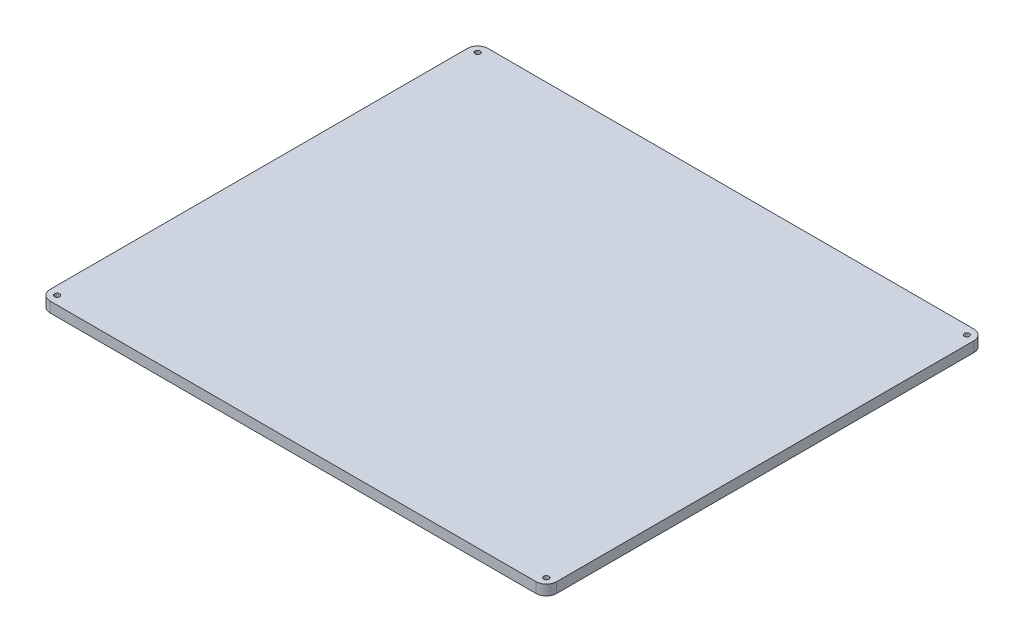
ISO-10303-21;
HEADER;
FILE_DESCRIPTION(('STEP AP214'),'2;1');
FILE_NAME('part.step','',(''),(''),'','','');
FILE_SCHEMA(('AUTOMOTIVE_DESIGN { 1 0 10303 214 1 1 1 1 }'));
ENDSEC;
DATA;
#1=APPLICATION_CONTEXT('core data for automotive mechanical design processes');
#2=APPLICATION_PROTOCOL_DEFINITION('international standard','automotive_design',2000,#1);
#3=PRODUCT_CONTEXT('',#1,'mechanical');
#4=PRODUCT('Part','Part','',(#3));
#5=PRODUCT_RELATED_PRODUCT_CATEGORY('part','',(#4));
#6=PRODUCT_DEFINITION_FORMATION('','',#4);
#7=PRODUCT_DEFINITION_CONTEXT('part definition',#1,'design');
#8=PRODUCT_DEFINITION('design','',#6,#7);
#9=PRODUCT_DEFINITION_SHAPE('','',#8);
#10=(LENGTH_UNIT() NAMED_UNIT(*) SI_UNIT(.MILLI.,.METRE.));
#11=(NAMED_UNIT(*) PLANE_ANGLE_UNIT() SI_UNIT($,.RADIAN.));
#12=(NAMED_UNIT(*) SI_UNIT($,.STERADIAN.) SOLID_ANGLE_UNIT());
#13=UNCERTAINTY_MEASURE_WITH_UNIT(LENGTH_MEASURE(1.E-05),#10,'distance_accuracy_value','');
#14=(GEOMETRIC_REPRESENTATION_CONTEXT(3) GLOBAL_UNCERTAINTY_ASSIGNED_CONTEXT((#13)) GLOBAL_UNIT_ASSIGNED_CONTEXT((#10,
#11,#12)) REPRESENTATION_CONTEXT('',''));
#15=CARTESIAN_POINT('',(0.,0.,0.));
#16=DIRECTION('',(0.,0.,1.));
#17=DIRECTION('',(1.,0.,0.));
#18=AXIS2_PLACEMENT_3D('',#15,#16,#17);
#19=CARTESIAN_POINT('',(161.504362330041,6.,127.25));
#20=DIRECTION('',(0.,-1.,0.));
#21=DIRECTION('',(0.,0.,-1.));
#22=AXIS2_PLACEMENT_3D('',#19,#20,#21);
#23=PLANE('',#22);
#24=CARTESIAN_POINT('',(161.504362330041,6.,127.25));
#25=DIRECTION('',(0.,1.,0.));
#26=DIRECTION('',(0.,0.,-1.));
#27=AXIS2_PLACEMENT_3D('',#24,#25,#26);
#28=CIRCLE('',#27,6.00000000000002);
#29=CARTESIAN_POINT('',(161.504362330041,6.,133.25));
#30=VERTEX_POINT('',#29);
#31=CARTESIAN_POINT('',(167.504362330041,6.,127.25));
#32=VERTEX_POINT('',#31);
#33=EDGE_CURVE('E145',#30,#32,#28,.T.);
#34=ORIENTED_EDGE('',*,*,#33,.T.);
#35=DIRECTION('',(0.,0.,-1.));
#36=VECTOR('',#35,1.);
#37=CARTESIAN_POINT('',(167.504362330041,6.,-115.75));
#38=LINE('',#37,#36);
#39=CARTESIAN_POINT('',(167.504362330041,6.,-115.75));
#40=VERTEX_POINT('',#39);
#41=EDGE_CURVE('E93',#32,#40,#38,.T.);
#42=ORIENTED_EDGE('',*,*,#41,.T.);
#43=CARTESIAN_POINT('',(161.504362330041,6.,-115.75));
#44=DIRECTION('',(0.,1.,0.));
#45=DIRECTION('',(0.,0.,1.));
#46=AXIS2_PLACEMENT_3D('',#43,#44,#45);
#47=CIRCLE('',#46,6.00000000000002);
#48=CARTESIAN_POINT('',(161.504362330041,6.,-121.75));
#49=VERTEX_POINT('',#48);
#50=EDGE_CURVE('E160',#40,#49,#47,.T.);
#51=ORIENTED_EDGE('',*,*,#50,.T.);
#52=DIRECTION('',(-1.,0.,0.));
#53=VECTOR('',#52,1.);
#54=CARTESIAN_POINT('',(-121.495637669959,6.,-121.75));
#55=LINE('',#54,#53);
#56=CARTESIAN_POINT('',(-121.495637669959,6.,-121.75));
#57=VERTEX_POINT('',#56);
#58=EDGE_CURVE('E173',#49,#57,#55,.T.);
#59=ORIENTED_EDGE('',*,*,#58,.T.);
#60=CARTESIAN_POINT('',(-121.495637669959,6.,-115.75));
#61=DIRECTION('',(0.,1.,0.));
#62=DIRECTION('',(0.,0.,-1.));
#63=AXIS2_PLACEMENT_3D('',#60,#61,#62);
#64=CIRCLE('',#63,6.00000000000001);
#65=CARTESIAN_POINT('',(-127.495637669959,6.,-115.75));
#66=VERTEX_POINT('',#65);
#67=EDGE_CURVE('E112',#57,#66,#64,.T.);
#68=ORIENTED_EDGE('',*,*,#67,.T.);
#69=DIRECTION('',(0.,0.,1.));
#70=VECTOR('',#69,1.);
#71=CARTESIAN_POINT('',(-127.495637669959,6.,-115.75));
#72=LINE('',#71,#70);
#73=CARTESIAN_POINT('',(-127.495637669959,6.,127.25));
#74=VERTEX_POINT('',#73);
#75=EDGE_CURVE('E106',#66,#74,#72,.T.);
#76=ORIENTED_EDGE('',*,*,#75,.T.);
#77=CARTESIAN_POINT('',(-121.495637669959,6.,127.25));
#78=DIRECTION('',(0.,1.,0.));
#79=DIRECTION('',(0.,0.,-1.));
#80=AXIS2_PLACEMENT_3D('',#77,#78,#79);
#81=CIRCLE('',#80,6.00000000000001);
#82=CARTESIAN_POINT('',(-121.495637669959,6.,133.25));
#83=VERTEX_POINT('',#82);
#84=EDGE_CURVE('E110',#74,#83,#81,.T.);
#85=ORIENTED_EDGE('',*,*,#84,.T.);
#86=DIRECTION('',(1.,0.,0.));
#87=VECTOR('',#86,1.);
#88=CARTESIAN_POINT('',(-121.495637669959,6.,133.25));
#89=LINE('',#88,#87);
#90=EDGE_CURVE('E50',#83,#30,#89,.T.);
#91=ORIENTED_EDGE('',*,*,#90,.T.);
#92=EDGE_LOOP('',(#34,#42,#51,#59,#68,#76,#85,#91));
#93=FACE_BOUND('',#92,.T.);
#94=CARTESIAN_POINT('',(162.504362330041,6.,-116.75));
#95=DIRECTION('',(0.,1.,0.));
#96=DIRECTION('',(0.,0.,1.));
#97=AXIS2_PLACEMENT_3D('',#94,#95,#96);
#98=CIRCLE('',#97,1.5);
#99=CARTESIAN_POINT('',(162.504362330041,6.,-115.25));
#100=VERTEX_POINT('',#99);
#101=EDGE_CURVE('E134',#100,#100,#98,.T.);
#102=ORIENTED_EDGE('',*,*,#101,.F.);
#103=EDGE_LOOP('',(#102));
#104=FACE_BOUND('',#103,.T.);
#105=CARTESIAN_POINT('',(162.504362330041,6.,128.25));
#106=DIRECTION('',(0.,1.,0.));
#107=DIRECTION('',(0.,0.,1.));
#108=AXIS2_PLACEMENT_3D('',#105,#106,#107);
#109=CIRCLE('',#108,1.5);
#110=CARTESIAN_POINT('',(162.504362330041,6.,129.75));
#111=VERTEX_POINT('',#110);
#112=EDGE_CURVE('E182',#111,#111,#109,.T.);
#113=ORIENTED_EDGE('',*,*,#112,.F.);
#114=EDGE_LOOP('',(#113));
#115=FACE_BOUND('',#114,.T.);
#116=CARTESIAN_POINT('',(-122.495637669959,6.,128.25));
#117=DIRECTION('',(0.,1.,0.));
#118=DIRECTION('',(0.,0.,1.));
#119=AXIS2_PLACEMENT_3D('',#116,#117,#118);
#120=CIRCLE('',#119,1.5);
#121=CARTESIAN_POINT('',(-122.495637669959,6.,129.75));
#122=VERTEX_POINT('',#121);
#123=EDGE_CURVE('E188',#122,#122,#120,.T.);
#124=ORIENTED_EDGE('',*,*,#123,.F.);
#125=EDGE_LOOP('',(#124));
#126=FACE_BOUND('',#125,.T.);
#127=CARTESIAN_POINT('',(-122.495637669959,6.,-116.75));
#128=DIRECTION('',(0.,1.,0.));
#129=DIRECTION('',(0.,0.,1.));
#130=AXIS2_PLACEMENT_3D('',#127,#128,#129);
#131=CIRCLE('',#130,1.5);
#132=CARTESIAN_POINT('',(-122.495637669959,6.,-115.25));
#133=VERTEX_POINT('',#132);
#134=EDGE_CURVE('E194',#133,#133,#131,.T.);
#135=ORIENTED_EDGE('',*,*,#134,.F.);
#136=EDGE_LOOP('',(#135));
#137=FACE_BOUND('',#136,.T.);
#138=ADVANCED_FACE('F33',(#93,#104,#115,#126,#137),#23,.F.);
#139=CARTESIAN_POINT('',(161.504362330041,0.,127.25));
#140=DIRECTION('',(0.,-1.,0.));
#141=DIRECTION('',(0.,0.,-1.));
#142=AXIS2_PLACEMENT_3D('',#139,#140,#141);
#143=PLANE('',#142);
#144=CARTESIAN_POINT('',(-122.495637669959,0.,128.25));
#145=DIRECTION('',(0.,1.,0.));
#146=DIRECTION('',(0.,0.,1.));
#147=AXIS2_PLACEMENT_3D('',#144,#145,#146);
#148=CIRCLE('',#147,1.5);
#149=CARTESIAN_POINT('',(-122.495637669959,0.,129.75));
#150=VERTEX_POINT('',#149);
#151=EDGE_CURVE('E191',#150,#150,#148,.T.);
#152=ORIENTED_EDGE('',*,*,#151,.T.);
#153=EDGE_LOOP('',(#152));
#154=FACE_BOUND('',#153,.T.);
#155=CARTESIAN_POINT('',(162.504362330041,0.,-116.75));
#156=DIRECTION('',(0.,1.,0.));
#157=DIRECTION('',(0.,0.,1.));
#158=AXIS2_PLACEMENT_3D('',#155,#156,#157);
#159=CIRCLE('',#158,1.5);
#160=CARTESIAN_POINT('',(162.504362330041,0.,-115.25));
#161=VERTEX_POINT('',#160);
#162=EDGE_CURVE('E179',#161,#161,#159,.T.);
#163=ORIENTED_EDGE('',*,*,#162,.T.);
#164=EDGE_LOOP('',(#163));
#165=FACE_BOUND('',#164,.T.);
#166=CARTESIAN_POINT('',(161.504362330041,0.,127.25));
#167=DIRECTION('',(0.,1.,0.));
#168=DIRECTION('',(0.,0.,-1.));
#169=AXIS2_PLACEMENT_3D('',#166,#167,#168);
#170=CIRCLE('',#169,6.00000000000002);
#171=CARTESIAN_POINT('',(161.504362330041,0.,133.25));
#172=VERTEX_POINT('',#171);
#173=CARTESIAN_POINT('',(167.504362330041,0.,127.25));
#174=VERTEX_POINT('',#173);
#175=EDGE_CURVE('E130',#172,#174,#170,.T.);
#176=ORIENTED_EDGE('',*,*,#175,.F.);
#177=DIRECTION('',(1.,0.,0.));
#178=VECTOR('',#177,1.);
#179=CARTESIAN_POINT('',(-121.495637669959,0.,133.25));
#180=LINE('',#179,#178);
#181=CARTESIAN_POINT('',(-121.495637669959,0.,133.25));
#182=VERTEX_POINT('',#181);
#183=EDGE_CURVE('E85',#182,#172,#180,.T.);
#184=ORIENTED_EDGE('',*,*,#183,.F.);
#185=CARTESIAN_POINT('',(-121.495637669959,0.,127.25));
#186=DIRECTION('',(0.,1.,0.));
#187=DIRECTION('',(0.,0.,-1.));
#188=AXIS2_PLACEMENT_3D('',#185,#186,#187);
#189=CIRCLE('',#188,6.00000000000001);
#190=CARTESIAN_POINT('',(-127.495637669959,0.,127.25));
#191=VERTEX_POINT('',#190);
#192=EDGE_CURVE('E79',#191,#182,#189,.T.);
#193=ORIENTED_EDGE('',*,*,#192,.F.);
#194=DIRECTION('',(0.,0.,1.));
#195=VECTOR('',#194,1.);
#196=CARTESIAN_POINT('',(-127.495637669959,0.,-115.75));
#197=LINE('',#196,#195);
#198=CARTESIAN_POINT('',(-127.495637669959,0.,-115.75));
#199=VERTEX_POINT('',#198);
#200=EDGE_CURVE('E120',#199,#191,#197,.T.);
#201=ORIENTED_EDGE('',*,*,#200,.F.);
#202=CARTESIAN_POINT('',(-121.495637669959,0.,-115.75));
#203=DIRECTION('',(0.,1.,0.));
#204=DIRECTION('',(0.,0.,-1.));
#205=AXIS2_PLACEMENT_3D('',#202,#203,#204);
#206=CIRCLE('',#205,6.00000000000001);
#207=CARTESIAN_POINT('',(-121.495637669959,0.,-121.75));
#208=VERTEX_POINT('',#207);
#209=EDGE_CURVE('E140',#208,#199,#206,.T.);
#210=ORIENTED_EDGE('',*,*,#209,.F.);
#211=DIRECTION('',(-1.,0.,0.));
#212=VECTOR('',#211,1.);
#213=CARTESIAN_POINT('',(-121.495637669959,0.,-121.75));
#214=LINE('',#213,#212);
#215=CARTESIAN_POINT('',(161.504362330041,0.,-121.75));
#216=VERTEX_POINT('',#215);
#217=EDGE_CURVE('E138',#216,#208,#214,.T.);
#218=ORIENTED_EDGE('',*,*,#217,.F.);
#219=CARTESIAN_POINT('',(161.504362330041,0.,-115.75));
#220=DIRECTION('',(0.,1.,0.));
#221=DIRECTION('',(0.,0.,1.));
#222=AXIS2_PLACEMENT_3D('',#219,#220,#221);
#223=CIRCLE('',#222,6.00000000000002);
#224=CARTESIAN_POINT('',(167.504362330041,0.,-115.75));
#225=VERTEX_POINT('',#224);
#226=EDGE_CURVE('E136',#225,#216,#223,.T.);
#227=ORIENTED_EDGE('',*,*,#226,.F.);
#228=DIRECTION('',(0.,0.,-1.));
#229=VECTOR('',#228,1.);
#230=CARTESIAN_POINT('',(167.504362330041,0.,-115.75));
#231=LINE('',#230,#229);
#232=EDGE_CURVE('E133',#174,#225,#231,.T.);
#233=ORIENTED_EDGE('',*,*,#232,.F.);
#234=EDGE_LOOP('',(#176,#184,#193,#201,#210,#218,#227,#233));
#235=FACE_BOUND('',#234,.T.);
#236=CARTESIAN_POINT('',(162.504362330041,0.,128.25));
#237=DIRECTION('',(0.,1.,0.));
#238=DIRECTION('',(0.,0.,1.));
#239=AXIS2_PLACEMENT_3D('',#236,#237,#238);
#240=CIRCLE('',#239,1.5);
#241=CARTESIAN_POINT('',(162.504362330041,0.,129.75));
#242=VERTEX_POINT('',#241);
#243=EDGE_CURVE('E185',#242,#242,#240,.T.);
#244=ORIENTED_EDGE('',*,*,#243,.T.);
#245=EDGE_LOOP('',(#244));
#246=FACE_BOUND('',#245,.T.);
#247=CARTESIAN_POINT('',(-122.495637669959,0.,-116.75));
#248=DIRECTION('',(0.,1.,0.));
#249=DIRECTION('',(0.,0.,1.));
#250=AXIS2_PLACEMENT_3D('',#247,#248,#249);
#251=CIRCLE('',#250,1.5);
#252=CARTESIAN_POINT('',(-122.495637669959,0.,-115.25));
#253=VERTEX_POINT('',#252);
#254=EDGE_CURVE('E197',#253,#253,#251,.T.);
#255=ORIENTED_EDGE('',*,*,#254,.T.);
#256=EDGE_LOOP('',(#255));
#257=FACE_BOUND('',#256,.T.);
#258=ADVANCED_FACE('F164',(#154,#165,#235,#246,#257),#143,.T.);
#259=CARTESIAN_POINT('',(161.504362330041,6.,127.25));
#260=DIRECTION('',(0.,-1.,0.));
#261=DIRECTION('',(0.,0.,-1.));
#262=AXIS2_PLACEMENT_3D('',#259,#260,#261);
#263=CYLINDRICAL_SURFACE('',#262,6.00000000000002);
#264=ORIENTED_EDGE('',*,*,#175,.T.);
#265=DIRECTION('',(0.,-1.,0.));
#266=VECTOR('',#265,1.);
#267=CARTESIAN_POINT('',(167.504362330041,6.,127.25));
#268=LINE('',#267,#266);
#269=EDGE_CURVE('E11',#32,#174,#268,.T.);
#270=ORIENTED_EDGE('',*,*,#269,.F.);
#271=ORIENTED_EDGE('',*,*,#33,.F.);
#272=DIRECTION('',(0.,-1.,0.));
#273=VECTOR('',#272,1.);
#274=CARTESIAN_POINT('',(161.504362330041,6.,133.25));
#275=LINE('',#274,#273);
#276=EDGE_CURVE('E126',#30,#172,#275,.T.);
#277=ORIENTED_EDGE('',*,*,#276,.T.);
#278=EDGE_LOOP('',(#264,#270,#271,#277));
#279=FACE_BOUND('',#278,.T.);
#280=ADVANCED_FACE('F35',(#279),#263,.T.);
#281=CARTESIAN_POINT('',(167.504362330041,6.,-115.75));
#282=DIRECTION('',(-1.,0.,0.));
#283=DIRECTION('',(0.,0.,1.));
#284=AXIS2_PLACEMENT_3D('',#281,#282,#283);
#285=PLANE('',#284);
#286=ORIENTED_EDGE('',*,*,#232,.T.);
#287=DIRECTION('',(0.,-1.,0.));
#288=VECTOR('',#287,1.);
#289=CARTESIAN_POINT('',(167.504362330041,6.,-115.75));
#290=LINE('',#289,#288);
#291=EDGE_CURVE('E42',#40,#225,#290,.T.);
#292=ORIENTED_EDGE('',*,*,#291,.F.);
#293=ORIENTED_EDGE('',*,*,#41,.F.);
#294=ORIENTED_EDGE('',*,*,#269,.T.);
#295=EDGE_LOOP('',(#286,#292,#293,#294));
#296=FACE_BOUND('',#295,.T.);
#297=ADVANCED_FACE('F229',(#296),#285,.F.);
#298=CARTESIAN_POINT('',(161.504362330041,6.,-115.75));
#299=DIRECTION('',(0.,-1.,0.));
#300=DIRECTION('',(0.,0.,-1.));
#301=AXIS2_PLACEMENT_3D('',#298,#299,#300);
#302=CYLINDRICAL_SURFACE('',#301,6.00000000000002);
#303=ORIENTED_EDGE('',*,*,#226,.T.);
#304=DIRECTION('',(0.,-1.,0.));
#305=VECTOR('',#304,1.);
#306=CARTESIAN_POINT('',(161.504362330041,6.,-121.75));
#307=LINE('',#306,#305);
#308=EDGE_CURVE('E152',#49,#216,#307,.T.);
#309=ORIENTED_EDGE('',*,*,#308,.F.);
#310=ORIENTED_EDGE('',*,*,#50,.F.);
#311=ORIENTED_EDGE('',*,*,#291,.T.);
#312=EDGE_LOOP('',(#303,#309,#310,#311));
#313=FACE_BOUND('',#312,.T.);
#314=ADVANCED_FACE('F158',(#313),#302,.T.);
#315=CARTESIAN_POINT('',(-121.495637669959,6.,-121.75));
#316=DIRECTION('',(0.,0.,1.));
#317=DIRECTION('',(1.,0.,0.));
#318=AXIS2_PLACEMENT_3D('',#315,#316,#317);
#319=PLANE('',#318);
#320=ORIENTED_EDGE('',*,*,#217,.T.);
#321=DIRECTION('',(0.,-1.,0.));
#322=VECTOR('',#321,1.);
#323=CARTESIAN_POINT('',(-121.495637669959,6.,-121.75));
#324=LINE('',#323,#322);
#325=EDGE_CURVE('E149',#57,#208,#324,.T.);
#326=ORIENTED_EDGE('',*,*,#325,.F.);
#327=ORIENTED_EDGE('',*,*,#58,.F.);
#328=ORIENTED_EDGE('',*,*,#308,.T.);
#329=EDGE_LOOP('',(#320,#326,#327,#328));
#330=FACE_BOUND('',#329,.T.);
#331=ADVANCED_FACE('F169',(#330),#319,.F.);
#332=CARTESIAN_POINT('',(-121.495637669959,6.,-115.75));
#333=DIRECTION('',(0.,-1.,0.));
#334=DIRECTION('',(0.,0.,-1.));
#335=AXIS2_PLACEMENT_3D('',#332,#333,#334);
#336=CYLINDRICAL_SURFACE('',#335,6.00000000000001);
#337=ORIENTED_EDGE('',*,*,#209,.T.);
#338=DIRECTION('',(0.,-1.,0.));
#339=VECTOR('',#338,1.);
#340=CARTESIAN_POINT('',(-127.495637669959,6.,-115.75));
#341=LINE('',#340,#339);
#342=EDGE_CURVE('E121',#66,#199,#341,.T.);
#343=ORIENTED_EDGE('',*,*,#342,.F.);
#344=ORIENTED_EDGE('',*,*,#67,.F.);
#345=ORIENTED_EDGE('',*,*,#325,.T.);
#346=EDGE_LOOP('',(#337,#343,#344,#345));
#347=FACE_BOUND('',#346,.T.);
#348=ADVANCED_FACE('F172',(#347),#336,.T.);
#349=CARTESIAN_POINT('',(-127.495637669959,6.,-115.75));
#350=DIRECTION('',(1.,0.,0.));
#351=DIRECTION('',(0.,0.,-1.));
#352=AXIS2_PLACEMENT_3D('',#349,#350,#351);
#353=PLANE('',#352);
#354=ORIENTED_EDGE('',*,*,#200,.T.);
#355=DIRECTION('',(0.,-1.,0.));
#356=VECTOR('',#355,1.);
#357=CARTESIAN_POINT('',(-127.495637669959,6.,127.25));
#358=LINE('',#357,#356);
#359=EDGE_CURVE('E117',#74,#191,#358,.T.);
#360=ORIENTED_EDGE('',*,*,#359,.F.);
#361=ORIENTED_EDGE('',*,*,#75,.F.);
#362=ORIENTED_EDGE('',*,*,#342,.T.);
#363=EDGE_LOOP('',(#354,#360,#361,#362));
#364=FACE_BOUND('',#363,.T.);
#365=ADVANCED_FACE('F118',(#364),#353,.F.);
#366=CARTESIAN_POINT('',(-121.495637669959,6.,127.25));
#367=DIRECTION('',(0.,-1.,0.));
#368=DIRECTION('',(0.,0.,-1.));
#369=AXIS2_PLACEMENT_3D('',#366,#367,#368);
#370=CYLINDRICAL_SURFACE('',#369,6.00000000000001);
#371=ORIENTED_EDGE('',*,*,#192,.T.);
#372=DIRECTION('',(0.,-1.,0.));
#373=VECTOR('',#372,1.);
#374=CARTESIAN_POINT('',(-121.495637669959,6.,133.25));
#375=LINE('',#374,#373);
#376=EDGE_CURVE('E122',#83,#182,#375,.T.);
#377=ORIENTED_EDGE('',*,*,#376,.F.);
#378=ORIENTED_EDGE('',*,*,#84,.F.);
#379=ORIENTED_EDGE('',*,*,#359,.T.);
#380=EDGE_LOOP('',(#371,#377,#378,#379));
#381=FACE_BOUND('',#380,.T.);
#382=ADVANCED_FACE('F124',(#381),#370,.T.);
#383=CARTESIAN_POINT('',(-121.495637669959,6.,133.25));
#384=DIRECTION('',(0.,0.,-1.));
#385=DIRECTION('',(-1.,0.,0.));
#386=AXIS2_PLACEMENT_3D('',#383,#384,#385);
#387=PLANE('',#386);
#388=ORIENTED_EDGE('',*,*,#183,.T.);
#389=ORIENTED_EDGE('',*,*,#276,.F.);
#390=ORIENTED_EDGE('',*,*,#90,.F.);
#391=ORIENTED_EDGE('',*,*,#376,.T.);
#392=EDGE_LOOP('',(#388,#389,#390,#391));
#393=FACE_BOUND('',#392,.T.);
#394=ADVANCED_FACE('F217',(#393),#387,.F.);
#395=CARTESIAN_POINT('',(162.504362330041,6.,-116.75));
#396=DIRECTION('',(0.,-1.,0.));
#397=DIRECTION('',(0.,0.,-1.));
#398=AXIS2_PLACEMENT_3D('',#395,#396,#397);
#399=CYLINDRICAL_SURFACE('',#398,1.5);
#400=ORIENTED_EDGE('',*,*,#101,.T.);
#401=EDGE_LOOP('',(#400));
#402=FACE_BOUND('',#401,.T.);
#403=ORIENTED_EDGE('',*,*,#162,.F.);
#404=EDGE_LOOP('',(#403));
#405=FACE_BOUND('',#404,.T.);
#406=ADVANCED_FACE('F214',(#402,#405),#399,.F.);
#407=CARTESIAN_POINT('',(162.504362330041,6.,128.25));
#408=DIRECTION('',(0.,-1.,0.));
#409=DIRECTION('',(0.,0.,-1.));
#410=AXIS2_PLACEMENT_3D('',#407,#408,#409);
#411=CYLINDRICAL_SURFACE('',#410,1.5);
#412=ORIENTED_EDGE('',*,*,#112,.T.);
#413=EDGE_LOOP('',(#412));
#414=FACE_BOUND('',#413,.T.);
#415=ORIENTED_EDGE('',*,*,#243,.F.);
#416=EDGE_LOOP('',(#415));
#417=FACE_BOUND('',#416,.T.);
#418=ADVANCED_FACE('F293',(#414,#417),#411,.F.);
#419=CARTESIAN_POINT('',(-122.495637669959,6.,128.25));
#420=DIRECTION('',(0.,-1.,0.));
#421=DIRECTION('',(0.,0.,-1.));
#422=AXIS2_PLACEMENT_3D('',#419,#420,#421);
#423=CYLINDRICAL_SURFACE('',#422,1.5);
#424=ORIENTED_EDGE('',*,*,#123,.T.);
#425=EDGE_LOOP('',(#424));
#426=FACE_BOUND('',#425,.T.);
#427=ORIENTED_EDGE('',*,*,#151,.F.);
#428=EDGE_LOOP('',(#427));
#429=FACE_BOUND('',#428,.T.);
#430=ADVANCED_FACE('F301',(#426,#429),#423,.F.);
#431=CARTESIAN_POINT('',(-122.495637669959,6.,-116.75));
#432=DIRECTION('',(0.,-1.,0.));
#433=DIRECTION('',(0.,0.,-1.));
#434=AXIS2_PLACEMENT_3D('',#431,#432,#433);
#435=CYLINDRICAL_SURFACE('',#434,1.5);
#436=ORIENTED_EDGE('',*,*,#134,.T.);
#437=EDGE_LOOP('',(#436));
#438=FACE_BOUND('',#437,.T.);
#439=ORIENTED_EDGE('',*,*,#254,.F.);
#440=EDGE_LOOP('',(#439));
#441=FACE_BOUND('',#440,.T.);
#442=ADVANCED_FACE('F203',(#438,#441),#435,.F.);
#443=CLOSED_SHELL('',(#138,#258,#280,#297,#314,#331,#348,#365,#382,#394,#406,#418,#430,#442));
#444=MANIFOLD_SOLID_BREP('B2',#443);
#445=ADVANCED_BREP_SHAPE_REPRESENTATION('',(#18,#444),#14);
#446=SHAPE_DEFINITION_REPRESENTATION(#9,#445);
ENDSEC;
END-ISO-10303-21;
